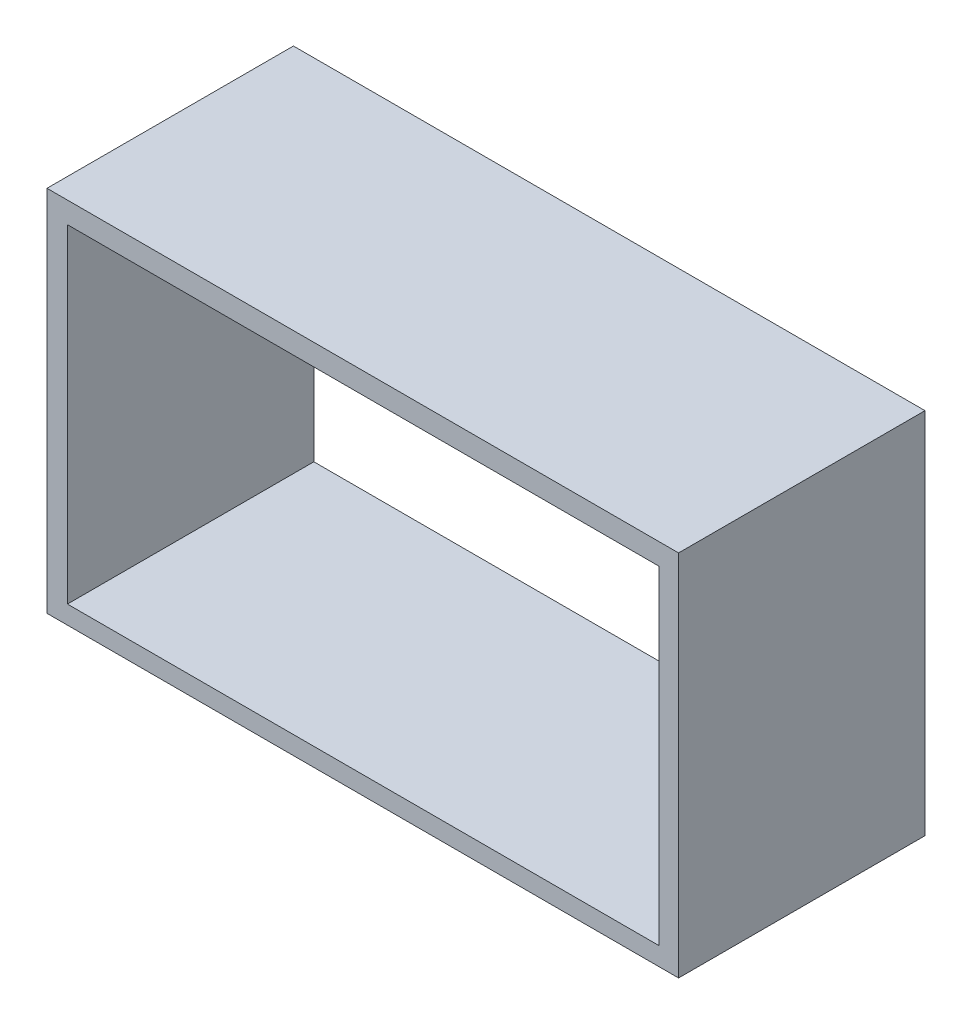
ISO-10303-21;
HEADER;
FILE_DESCRIPTION(('STEP AP214'),'2;1');
FILE_NAME('part.step','',(''),(''),'','','');
FILE_SCHEMA(('AUTOMOTIVE_DESIGN { 1 0 10303 214 1 1 1 1 }'));
ENDSEC;
DATA;
#1=APPLICATION_CONTEXT('core data for automotive mechanical design processes');
#2=APPLICATION_PROTOCOL_DEFINITION('international standard','automotive_design',2000,#1);
#3=PRODUCT_CONTEXT('',#1,'mechanical');
#4=PRODUCT('Part','Part','',(#3));
#5=PRODUCT_RELATED_PRODUCT_CATEGORY('part','',(#4));
#6=PRODUCT_DEFINITION_FORMATION('','',#4);
#7=PRODUCT_DEFINITION_CONTEXT('part definition',#1,'design');
#8=PRODUCT_DEFINITION('design','',#6,#7);
#9=PRODUCT_DEFINITION_SHAPE('','',#8);
#10=(LENGTH_UNIT() NAMED_UNIT(*) SI_UNIT(.MILLI.,.METRE.));
#11=(NAMED_UNIT(*) PLANE_ANGLE_UNIT() SI_UNIT($,.RADIAN.));
#12=(NAMED_UNIT(*) SI_UNIT($,.STERADIAN.) SOLID_ANGLE_UNIT());
#13=UNCERTAINTY_MEASURE_WITH_UNIT(LENGTH_MEASURE(1.E-05),#10,'distance_accuracy_value','');
#14=(GEOMETRIC_REPRESENTATION_CONTEXT(3) GLOBAL_UNCERTAINTY_ASSIGNED_CONTEXT((#13)) GLOBAL_UNIT_ASSIGNED_CONTEXT((#10,
#11,#12)) REPRESENTATION_CONTEXT('',''));
#15=CARTESIAN_POINT('',(0.,0.,0.));
#16=DIRECTION('',(0.,0.,1.));
#17=DIRECTION('',(1.,0.,0.));
#18=AXIS2_PLACEMENT_3D('',#15,#16,#17);
#19=CARTESIAN_POINT('',(0.,0.,15.));
#20=DIRECTION('',(0.,0.,1.));
#21=DIRECTION('',(1.,0.,0.));
#22=AXIS2_PLACEMENT_3D('',#19,#20,#21);
#23=PLANE('',#22);
#24=DIRECTION('',(0.,-1.,0.));
#25=VECTOR('',#24,1.);
#26=CARTESIAN_POINT('',(-10.3556456753625,13.2951630712055,15.));
#27=LINE('',#26,#25);
#28=CARTESIAN_POINT('',(-10.3556456753625,13.2951630712055,15.));
#29=VERTEX_POINT('',#28);
#30=CARTESIAN_POINT('',(-10.3556456753625,-9.11295205830768,15.));
#31=VERTEX_POINT('',#30);
#32=EDGE_CURVE('E143',#29,#31,#27,.T.);
#33=ORIENTED_EDGE('',*,*,#32,.T.);
#34=DIRECTION('',(1.,0.,0.));
#35=VECTOR('',#34,1.);
#36=CARTESIAN_POINT('',(-10.3556456753625,-9.11295205830768,15.));
#37=LINE('',#36,#35);
#38=CARTESIAN_POINT('',(28.0889480132911,-9.11295205830768,15.));
#39=VERTEX_POINT('',#38);
#40=EDGE_CURVE('E146',#31,#39,#37,.T.);
#41=ORIENTED_EDGE('',*,*,#40,.T.);
#42=DIRECTION('',(0.,1.,0.));
#43=VECTOR('',#42,1.);
#44=CARTESIAN_POINT('',(28.0889480132911,13.2951630712055,15.));
#45=LINE('',#44,#43);
#46=CARTESIAN_POINT('',(28.0889480132911,13.2951630712055,15.));
#47=VERTEX_POINT('',#46);
#48=EDGE_CURVE('E149',#39,#47,#45,.T.);
#49=ORIENTED_EDGE('',*,*,#48,.T.);
#50=DIRECTION('',(-1.,0.,0.));
#51=VECTOR('',#50,1.);
#52=CARTESIAN_POINT('',(-10.3556456753625,13.2951630712055,15.));
#53=LINE('',#52,#51);
#54=EDGE_CURVE('E151',#47,#29,#53,.T.);
#55=ORIENTED_EDGE('',*,*,#54,.T.);
#56=EDGE_LOOP('',(#33,#41,#49,#55));
#57=FACE_BOUND('',#56,.T.);
#58=DIRECTION('',(1.,0.,0.));
#59=VECTOR('',#58,1.);
#60=CARTESIAN_POINT('',(-9.11187189174687,-8.00118328006595,15.));
#61=LINE('',#60,#59);
#62=CARTESIAN_POINT('',(-9.11187189174687,-8.00118328006595,15.));
#63=VERTEX_POINT('',#62);
#64=CARTESIAN_POINT('',(26.8881281082531,-8.00118328006595,15.));
#65=VERTEX_POINT('',#64);
#66=EDGE_CURVE('E115',#63,#65,#61,.T.);
#67=ORIENTED_EDGE('',*,*,#66,.F.);
#68=DIRECTION('',(0.,-1.,0.));
#69=VECTOR('',#68,1.);
#70=CARTESIAN_POINT('',(-9.11187189174687,11.9988167199341,15.));
#71=LINE('',#70,#69);
#72=CARTESIAN_POINT('',(-9.11187189174687,11.9988167199341,15.));
#73=VERTEX_POINT('',#72);
#74=EDGE_CURVE('E107',#73,#63,#71,.T.);
#75=ORIENTED_EDGE('',*,*,#74,.F.);
#76=DIRECTION('',(-1.,0.,0.));
#77=VECTOR('',#76,1.);
#78=CARTESIAN_POINT('',(-9.11187189174687,11.9988167199341,15.));
#79=LINE('',#78,#77);
#80=CARTESIAN_POINT('',(26.8881281082531,11.9988167199341,15.));
#81=VERTEX_POINT('',#80);
#82=EDGE_CURVE('E129',#81,#73,#79,.T.);
#83=ORIENTED_EDGE('',*,*,#82,.F.);
#84=DIRECTION('',(0.,1.,0.));
#85=VECTOR('',#84,1.);
#86=CARTESIAN_POINT('',(26.8881281082531,11.9988167199341,15.));
#87=LINE('',#86,#85);
#88=EDGE_CURVE('E127',#65,#81,#87,.T.);
#89=ORIENTED_EDGE('',*,*,#88,.F.);
#90=EDGE_LOOP('',(#67,#75,#83,#89));
#91=FACE_BOUND('',#90,.T.);
#92=ADVANCED_FACE('F42',(#57,#91),#23,.T.);
#93=CARTESIAN_POINT('',(0.,0.,0.));
#94=DIRECTION('',(0.,0.,1.));
#95=DIRECTION('',(1.,0.,0.));
#96=AXIS2_PLACEMENT_3D('',#93,#94,#95);
#97=PLANE('',#96);
#98=DIRECTION('',(0.,-1.,0.));
#99=VECTOR('',#98,1.);
#100=CARTESIAN_POINT('',(-10.3556456753625,13.2951630712055,0.));
#101=LINE('',#100,#99);
#102=CARTESIAN_POINT('',(-10.3556456753625,13.2951630712055,0.));
#103=VERTEX_POINT('',#102);
#104=CARTESIAN_POINT('',(-10.3556456753625,-9.11295205830768,0.));
#105=VERTEX_POINT('',#104);
#106=EDGE_CURVE('E123',#103,#105,#101,.T.);
#107=ORIENTED_EDGE('',*,*,#106,.F.);
#108=DIRECTION('',(-1.,0.,0.));
#109=VECTOR('',#108,1.);
#110=CARTESIAN_POINT('',(-10.3556456753625,13.2951630712055,0.));
#111=LINE('',#110,#109);
#112=CARTESIAN_POINT('',(28.0889480132911,13.2951630712055,0.));
#113=VERTEX_POINT('',#112);
#114=EDGE_CURVE('E147',#113,#103,#111,.T.);
#115=ORIENTED_EDGE('',*,*,#114,.F.);
#116=DIRECTION('',(0.,1.,0.));
#117=VECTOR('',#116,1.);
#118=CARTESIAN_POINT('',(28.0889480132911,13.2951630712055,0.));
#119=LINE('',#118,#117);
#120=CARTESIAN_POINT('',(28.0889480132911,-9.11295205830768,0.));
#121=VERTEX_POINT('',#120);
#122=EDGE_CURVE('E158',#121,#113,#119,.T.);
#123=ORIENTED_EDGE('',*,*,#122,.F.);
#124=DIRECTION('',(1.,0.,0.));
#125=VECTOR('',#124,1.);
#126=CARTESIAN_POINT('',(-10.3556456753625,-9.11295205830768,0.));
#127=LINE('',#126,#125);
#128=EDGE_CURVE('E156',#105,#121,#127,.T.);
#129=ORIENTED_EDGE('',*,*,#128,.F.);
#130=EDGE_LOOP('',(#107,#115,#123,#129));
#131=FACE_BOUND('',#130,.T.);
#132=DIRECTION('',(0.,-1.,0.));
#133=VECTOR('',#132,1.);
#134=CARTESIAN_POINT('',(-9.11187189174687,11.9988167199341,0.));
#135=LINE('',#134,#133);
#136=CARTESIAN_POINT('',(-9.11187189174687,11.9988167199341,0.));
#137=VERTEX_POINT('',#136);
#138=CARTESIAN_POINT('',(-9.11187189174687,-8.00118328006595,0.));
#139=VERTEX_POINT('',#138);
#140=EDGE_CURVE('E65',#137,#139,#135,.T.);
#141=ORIENTED_EDGE('',*,*,#140,.T.);
#142=DIRECTION('',(1.,0.,0.));
#143=VECTOR('',#142,1.);
#144=CARTESIAN_POINT('',(-9.11187189174687,-8.00118328006595,0.));
#145=LINE('',#144,#143);
#146=CARTESIAN_POINT('',(26.8881281082531,-8.00118328006595,0.));
#147=VERTEX_POINT('',#146);
#148=EDGE_CURVE('E122',#139,#147,#145,.T.);
#149=ORIENTED_EDGE('',*,*,#148,.T.);
#150=DIRECTION('',(0.,1.,0.));
#151=VECTOR('',#150,1.);
#152=CARTESIAN_POINT('',(26.8881281082531,11.9988167199341,0.));
#153=LINE('',#152,#151);
#154=CARTESIAN_POINT('',(26.8881281082531,11.9988167199341,0.));
#155=VERTEX_POINT('',#154);
#156=EDGE_CURVE('E135',#147,#155,#153,.T.);
#157=ORIENTED_EDGE('',*,*,#156,.T.);
#158=DIRECTION('',(-1.,0.,0.));
#159=VECTOR('',#158,1.);
#160=CARTESIAN_POINT('',(-9.11187189174687,11.9988167199341,0.));
#161=LINE('',#160,#159);
#162=EDGE_CURVE('E116',#155,#137,#161,.T.);
#163=ORIENTED_EDGE('',*,*,#162,.T.);
#164=EDGE_LOOP('',(#141,#149,#157,#163));
#165=FACE_BOUND('',#164,.T.);
#166=ADVANCED_FACE('F176',(#131,#165),#97,.F.);
#167=CARTESIAN_POINT('',(-10.3556456753625,13.2951630712055,15.));
#168=DIRECTION('',(1.,0.,0.));
#169=DIRECTION('',(0.,0.,-1.));
#170=AXIS2_PLACEMENT_3D('',#167,#168,#169);
#171=PLANE('',#170);
#172=ORIENTED_EDGE('',*,*,#106,.T.);
#173=DIRECTION('',(0.,0.,-1.));
#174=VECTOR('',#173,1.);
#175=CARTESIAN_POINT('',(-10.3556456753625,-9.11295205830768,15.));
#176=LINE('',#175,#174);
#177=EDGE_CURVE('E11',#31,#105,#176,.T.);
#178=ORIENTED_EDGE('',*,*,#177,.F.);
#179=ORIENTED_EDGE('',*,*,#32,.F.);
#180=DIRECTION('',(0.,0.,-1.));
#181=VECTOR('',#180,1.);
#182=CARTESIAN_POINT('',(-10.3556456753625,13.2951630712055,15.));
#183=LINE('',#182,#181);
#184=EDGE_CURVE('E153',#29,#103,#183,.T.);
#185=ORIENTED_EDGE('',*,*,#184,.T.);
#186=EDGE_LOOP('',(#172,#178,#179,#185));
#187=FACE_BOUND('',#186,.T.);
#188=ADVANCED_FACE('F44',(#187),#171,.F.);
#189=CARTESIAN_POINT('',(-10.3556456753625,-9.11295205830768,15.));
#190=DIRECTION('',(0.,1.,0.));
#191=DIRECTION('',(0.,0.,1.));
#192=AXIS2_PLACEMENT_3D('',#189,#190,#191);
#193=PLANE('',#192);
#194=ORIENTED_EDGE('',*,*,#128,.T.);
#195=DIRECTION('',(0.,0.,-1.));
#196=VECTOR('',#195,1.);
#197=CARTESIAN_POINT('',(28.0889480132911,-9.11295205830768,15.));
#198=LINE('',#197,#196);
#199=EDGE_CURVE('E50',#39,#121,#198,.T.);
#200=ORIENTED_EDGE('',*,*,#199,.F.);
#201=ORIENTED_EDGE('',*,*,#40,.F.);
#202=ORIENTED_EDGE('',*,*,#177,.T.);
#203=EDGE_LOOP('',(#194,#200,#201,#202));
#204=FACE_BOUND('',#203,.T.);
#205=ADVANCED_FACE('F186',(#204),#193,.F.);
#206=CARTESIAN_POINT('',(28.0889480132911,13.2951630712055,15.));
#207=DIRECTION('',(-1.,0.,0.));
#208=DIRECTION('',(0.,0.,1.));
#209=AXIS2_PLACEMENT_3D('',#206,#207,#208);
#210=PLANE('',#209);
#211=ORIENTED_EDGE('',*,*,#122,.T.);
#212=DIRECTION('',(0.,0.,-1.));
#213=VECTOR('',#212,1.);
#214=CARTESIAN_POINT('',(28.0889480132911,13.2951630712055,15.));
#215=LINE('',#214,#213);
#216=EDGE_CURVE('E163',#47,#113,#215,.T.);
#217=ORIENTED_EDGE('',*,*,#216,.F.);
#218=ORIENTED_EDGE('',*,*,#48,.F.);
#219=ORIENTED_EDGE('',*,*,#199,.T.);
#220=EDGE_LOOP('',(#211,#217,#218,#219));
#221=FACE_BOUND('',#220,.T.);
#222=ADVANCED_FACE('F170',(#221),#210,.F.);
#223=CARTESIAN_POINT('',(-10.3556456753625,13.2951630712055,15.));
#224=DIRECTION('',(0.,-1.,0.));
#225=DIRECTION('',(0.,0.,-1.));
#226=AXIS2_PLACEMENT_3D('',#223,#224,#225);
#227=PLANE('',#226);
#228=ORIENTED_EDGE('',*,*,#114,.T.);
#229=ORIENTED_EDGE('',*,*,#184,.F.);
#230=ORIENTED_EDGE('',*,*,#54,.F.);
#231=ORIENTED_EDGE('',*,*,#216,.T.);
#232=EDGE_LOOP('',(#228,#229,#230,#231));
#233=FACE_BOUND('',#232,.T.);
#234=ADVANCED_FACE('F180',(#233),#227,.F.);
#235=CARTESIAN_POINT('',(-9.11187189174687,11.9988167199341,15.));
#236=DIRECTION('',(1.,0.,0.));
#237=DIRECTION('',(0.,1.,0.));
#238=AXIS2_PLACEMENT_3D('',#235,#236,#237);
#239=PLANE('',#238);
#240=ORIENTED_EDGE('',*,*,#140,.F.);
#241=DIRECTION('',(0.,0.,-1.));
#242=VECTOR('',#241,1.);
#243=CARTESIAN_POINT('',(-9.11187189174687,11.9988167199341,15.));
#244=LINE('',#243,#242);
#245=EDGE_CURVE('E111',#73,#137,#244,.T.);
#246=ORIENTED_EDGE('',*,*,#245,.F.);
#247=ORIENTED_EDGE('',*,*,#74,.T.);
#248=DIRECTION('',(0.,0.,-1.));
#249=VECTOR('',#248,1.);
#250=CARTESIAN_POINT('',(-9.11187189174687,-8.00118328006595,15.));
#251=LINE('',#250,#249);
#252=EDGE_CURVE('E110',#63,#139,#251,.T.);
#253=ORIENTED_EDGE('',*,*,#252,.T.);
#254=EDGE_LOOP('',(#240,#246,#247,#253));
#255=FACE_BOUND('',#254,.T.);
#256=ADVANCED_FACE('F109',(#255),#239,.T.);
#257=CARTESIAN_POINT('',(-9.11187189174687,-8.00118328006595,15.));
#258=DIRECTION('',(0.,1.,0.));
#259=DIRECTION('',(0.,0.,1.));
#260=AXIS2_PLACEMENT_3D('',#257,#258,#259);
#261=PLANE('',#260);
#262=ORIENTED_EDGE('',*,*,#148,.F.);
#263=ORIENTED_EDGE('',*,*,#252,.F.);
#264=ORIENTED_EDGE('',*,*,#66,.T.);
#265=DIRECTION('',(0.,0.,-1.));
#266=VECTOR('',#265,1.);
#267=CARTESIAN_POINT('',(26.8881281082531,-8.00118328006595,15.));
#268=LINE('',#267,#266);
#269=EDGE_CURVE('E124',#65,#147,#268,.T.);
#270=ORIENTED_EDGE('',*,*,#269,.T.);
#271=EDGE_LOOP('',(#262,#263,#264,#270));
#272=FACE_BOUND('',#271,.T.);
#273=ADVANCED_FACE('F119',(#272),#261,.T.);
#274=CARTESIAN_POINT('',(26.8881281082531,11.9988167199341,15.));
#275=DIRECTION('',(-1.,0.,0.));
#276=DIRECTION('',(0.,0.,1.));
#277=AXIS2_PLACEMENT_3D('',#274,#275,#276);
#278=PLANE('',#277);
#279=ORIENTED_EDGE('',*,*,#156,.F.);
#280=ORIENTED_EDGE('',*,*,#269,.F.);
#281=ORIENTED_EDGE('',*,*,#88,.T.);
#282=DIRECTION('',(0.,0.,-1.));
#283=VECTOR('',#282,1.);
#284=CARTESIAN_POINT('',(26.8881281082531,11.9988167199341,15.));
#285=LINE('',#284,#283);
#286=EDGE_CURVE('E57',#81,#155,#285,.T.);
#287=ORIENTED_EDGE('',*,*,#286,.T.);
#288=EDGE_LOOP('',(#279,#280,#281,#287));
#289=FACE_BOUND('',#288,.T.);
#290=ADVANCED_FACE('F209',(#289),#278,.T.);
#291=CARTESIAN_POINT('',(-9.11187189174687,11.9988167199341,15.));
#292=DIRECTION('',(0.,-1.,0.));
#293=DIRECTION('',(0.,0.,-1.));
#294=AXIS2_PLACEMENT_3D('',#291,#292,#293);
#295=PLANE('',#294);
#296=ORIENTED_EDGE('',*,*,#162,.F.);
#297=ORIENTED_EDGE('',*,*,#286,.F.);
#298=ORIENTED_EDGE('',*,*,#82,.T.);
#299=ORIENTED_EDGE('',*,*,#245,.T.);
#300=EDGE_LOOP('',(#296,#297,#298,#299));
#301=FACE_BOUND('',#300,.T.);
#302=ADVANCED_FACE('F213',(#301),#295,.T.);
#303=CLOSED_SHELL('',(#92,#166,#188,#205,#222,#234,#256,#273,#290,#302));
#304=MANIFOLD_SOLID_BREP('B2',#303);
#305=ADVANCED_BREP_SHAPE_REPRESENTATION('',(#18,#304),#14);
#306=SHAPE_DEFINITION_REPRESENTATION(#9,#305);
ENDSEC;
END-ISO-10303-21;
